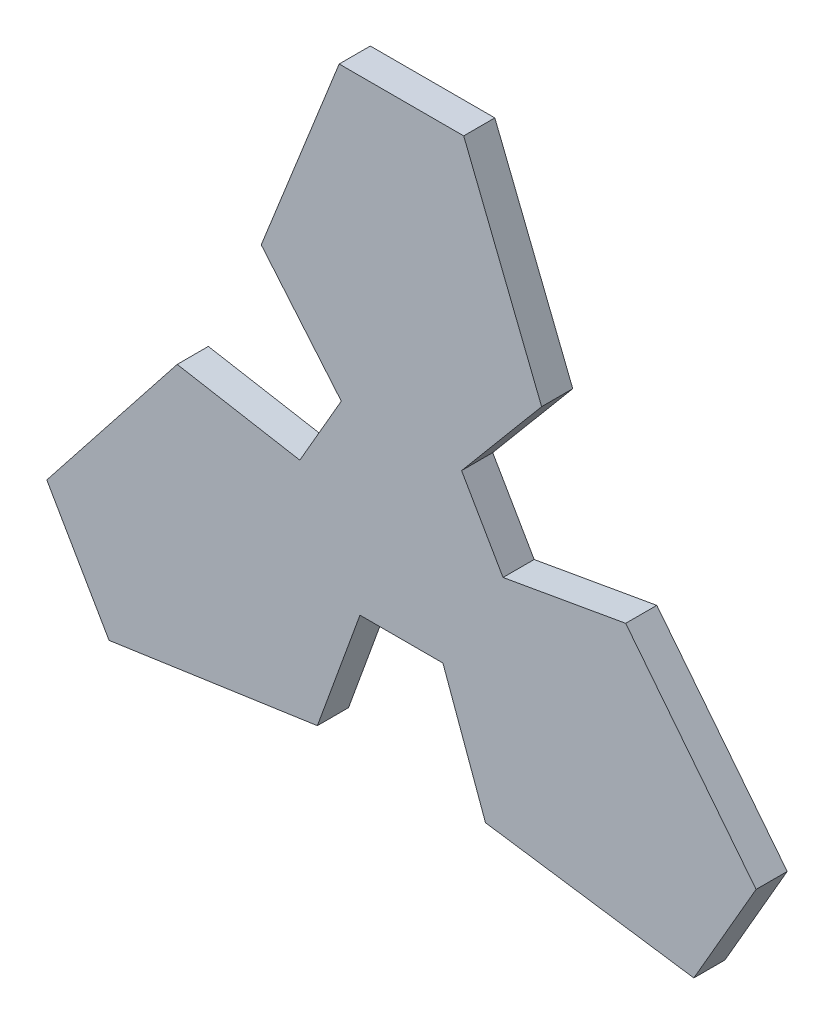
ISO-10303-21;
HEADER;
FILE_DESCRIPTION(('STEP AP214'),'2;1');
FILE_NAME('part.step','',(''),(''),'','','');
FILE_SCHEMA(('AUTOMOTIVE_DESIGN { 1 0 10303 214 1 1 1 1 }'));
ENDSEC;
DATA;
#1=APPLICATION_CONTEXT('core data for automotive mechanical design processes');
#2=APPLICATION_PROTOCOL_DEFINITION('international standard','automotive_design',2000,#1);
#3=PRODUCT_CONTEXT('',#1,'mechanical');
#4=PRODUCT('Part','Part','',(#3));
#5=PRODUCT_RELATED_PRODUCT_CATEGORY('part','',(#4));
#6=PRODUCT_DEFINITION_FORMATION('','',#4);
#7=PRODUCT_DEFINITION_CONTEXT('part definition',#1,'design');
#8=PRODUCT_DEFINITION('design','',#6,#7);
#9=PRODUCT_DEFINITION_SHAPE('','',#8);
#10=(LENGTH_UNIT() NAMED_UNIT(*) SI_UNIT(.MILLI.,.METRE.));
#11=(NAMED_UNIT(*) PLANE_ANGLE_UNIT() SI_UNIT($,.RADIAN.));
#12=(NAMED_UNIT(*) SI_UNIT($,.STERADIAN.) SOLID_ANGLE_UNIT());
#13=UNCERTAINTY_MEASURE_WITH_UNIT(LENGTH_MEASURE(1.E-05),#10,'distance_accuracy_value','');
#14=(GEOMETRIC_REPRESENTATION_CONTEXT(3) GLOBAL_UNCERTAINTY_ASSIGNED_CONTEXT((#13)) GLOBAL_UNIT_ASSIGNED_CONTEXT((#10,
#11,#12)) REPRESENTATION_CONTEXT('',''));
#15=CARTESIAN_POINT('',(0.,0.,0.));
#16=DIRECTION('',(0.,0.,1.));
#17=DIRECTION('',(1.,0.,0.));
#18=AXIS2_PLACEMENT_3D('',#15,#16,#17);
#19=CARTESIAN_POINT('',(-16.3205080756888,1.73205080756886,5.));
#20=DIRECTION('',(-0.173648177666928,-0.984807753012209,0.));
#21=DIRECTION('',(0.984807753012209,-0.173648177666928,0.));
#22=AXIS2_PLACEMENT_3D('',#19,#20,#21);
#23=PLANE('',#22);
#24=DIRECTION('',(-0.984807753012209,0.173648177666928,0.));
#25=VECTOR('',#24,1.);
#26=CARTESIAN_POINT('',(-16.3205080756888,1.73205080756886,0.));
#27=LINE('',#26,#25);
#28=CARTESIAN_POINT('',(-16.3205080756888,1.73205080756886,0.));
#29=VERTEX_POINT('',#28);
#30=CARTESIAN_POINT('',(-36.016663135933,5.20501436090742,0.));
#31=VERTEX_POINT('',#30);
#32=EDGE_CURVE('E208',#29,#31,#27,.T.);
#33=ORIENTED_EDGE('',*,*,#32,.T.);
#34=DIRECTION('',(0.,0.,-1.));
#35=VECTOR('',#34,1.);
#36=CARTESIAN_POINT('',(-36.016663135933,5.20501436090742,5.));
#37=LINE('',#36,#35);
#38=CARTESIAN_POINT('',(-36.016663135933,5.20501436090742,5.));
#39=VERTEX_POINT('',#38);
#40=EDGE_CURVE('E52',#39,#31,#37,.T.);
#41=ORIENTED_EDGE('',*,*,#40,.F.);
#42=DIRECTION('',(-0.984807753012209,0.173648177666928,0.));
#43=VECTOR('',#42,1.);
#44=CARTESIAN_POINT('',(-16.3205080756888,1.73205080756886,5.));
#45=LINE('',#44,#43);
#46=CARTESIAN_POINT('',(-16.3205080756888,1.73205080756886,5.));
#47=VERTEX_POINT('',#46);
#48=EDGE_CURVE('E134',#47,#39,#45,.T.);
#49=ORIENTED_EDGE('',*,*,#48,.F.);
#50=DIRECTION('',(0.,0.,-1.));
#51=VECTOR('',#50,1.);
#52=CARTESIAN_POINT('',(-16.3205080756888,1.73205080756886,5.));
#53=LINE('',#52,#51);
#54=EDGE_CURVE('E11',#47,#29,#53,.T.);
#55=ORIENTED_EDGE('',*,*,#54,.T.);
#56=EDGE_LOOP('',(#33,#41,#49,#55));
#57=FACE_BOUND('',#56,.T.);
#58=ADVANCED_FACE('F43',(#57),#23,.F.);
#59=CARTESIAN_POINT('',(-36.016663135933,5.20501436090742,5.));
#60=DIRECTION('',(0.7850485597326,-0.619434224806614,0.));
#61=DIRECTION('',(0.619434224806614,0.7850485597326,0.));
#62=AXIS2_PLACEMENT_3D('',#59,#60,#61);
#63=PLANE('',#62);
#64=DIRECTION('',(-0.619434224806614,-0.7850485597326,0.));
#65=VECTOR('',#64,1.);
#66=CARTESIAN_POINT('',(-36.016663135933,5.20501436090742,0.));
#67=LINE('',#66,#65);
#68=CARTESIAN_POINT('',(-56.9615242270665,-21.3397459621553,0.));
#69=VERTEX_POINT('',#68);
#70=EDGE_CURVE('E211',#31,#69,#67,.T.);
#71=ORIENTED_EDGE('',*,*,#70,.T.);
#72=DIRECTION('',(0.,0.,-1.));
#73=VECTOR('',#72,1.);
#74=CARTESIAN_POINT('',(-56.9615242270665,-21.3397459621553,5.));
#75=LINE('',#74,#73);
#76=CARTESIAN_POINT('',(-56.9615242270665,-21.3397459621553,5.));
#77=VERTEX_POINT('',#76);
#78=EDGE_CURVE('E311',#77,#69,#75,.T.);
#79=ORIENTED_EDGE('',*,*,#78,.F.);
#80=DIRECTION('',(-0.619434224806614,-0.7850485597326,0.));
#81=VECTOR('',#80,1.);
#82=CARTESIAN_POINT('',(-36.016663135933,5.20501436090742,5.));
#83=LINE('',#82,#81);
#84=EDGE_CURVE('E321',#39,#77,#83,.T.);
#85=ORIENTED_EDGE('',*,*,#84,.F.);
#86=ORIENTED_EDGE('',*,*,#40,.T.);
#87=EDGE_LOOP('',(#71,#79,#85,#86));
#88=FACE_BOUND('',#87,.T.);
#89=ADVANCED_FACE('F319',(#88),#63,.F.);
#90=CARTESIAN_POINT('',(-56.9615242270665,-21.3397459621553,5.));
#91=DIRECTION('',(0.866025403784442,0.499999999999994,0.));
#92=DIRECTION('',(-0.499999999999994,0.866025403784442,0.));
#93=AXIS2_PLACEMENT_3D('',#90,#91,#92);
#94=PLANE('',#93);
#95=DIRECTION('',(0.499999999999994,-0.866025403784442,0.));
#96=VECTOR('',#95,1.);
#97=CARTESIAN_POINT('',(-56.9615242270665,-21.3397459621553,0.));
#98=LINE('',#97,#96);
#99=CARTESIAN_POINT('',(-46.9615242270667,-38.660254037844,0.));
#100=VERTEX_POINT('',#99);
#101=EDGE_CURVE('E214',#69,#100,#98,.T.);
#102=ORIENTED_EDGE('',*,*,#101,.T.);
#103=DIRECTION('',(0.,0.,-1.));
#104=VECTOR('',#103,1.);
#105=CARTESIAN_POINT('',(-46.9615242270667,-38.660254037844,5.));
#106=LINE('',#105,#104);
#107=CARTESIAN_POINT('',(-46.9615242270667,-38.660254037844,5.));
#108=VERTEX_POINT('',#107);
#109=EDGE_CURVE('E307',#108,#100,#106,.T.);
#110=ORIENTED_EDGE('',*,*,#109,.F.);
#111=DIRECTION('',(0.499999999999994,-0.866025403784442,0.));
#112=VECTOR('',#111,1.);
#113=CARTESIAN_POINT('',(-56.9615242270665,-21.3397459621553,5.));
#114=LINE('',#113,#112);
#115=EDGE_CURVE('E341',#77,#108,#114,.T.);
#116=ORIENTED_EDGE('',*,*,#115,.F.);
#117=ORIENTED_EDGE('',*,*,#78,.T.);
#118=EDGE_LOOP('',(#102,#110,#116,#117));
#119=FACE_BOUND('',#118,.T.);
#120=ADVANCED_FACE('F331',(#119),#94,.F.);
#121=CARTESIAN_POINT('',(-13.5006569043578,-33.7938524157182,5.));
#122=DIRECTION('',(-0.143921494789726,0.989589108336127,0.));
#123=DIRECTION('',(-0.989589108336127,-0.143921494789726,0.));
#124=AXIS2_PLACEMENT_3D('',#121,#122,#123);
#125=PLANE('',#124);
#126=DIRECTION('',(0.989589108336127,0.143921494789726,0.));
#127=VECTOR('',#126,1.);
#128=CARTESIAN_POINT('',(-13.5006569043578,-33.7938524157182,0.));
#129=LINE('',#128,#127);
#130=CARTESIAN_POINT('',(-13.5006569043578,-33.7938524157182,0.));
#131=VERTEX_POINT('',#130);
#132=EDGE_CURVE('E217',#100,#131,#129,.T.);
#133=ORIENTED_EDGE('',*,*,#132,.T.);
#134=DIRECTION('',(0.,0.,-1.));
#135=VECTOR('',#134,1.);
#136=CARTESIAN_POINT('',(-13.5006569043578,-33.7938524157182,5.));
#137=LINE('',#136,#135);
#138=CARTESIAN_POINT('',(-13.5006569043578,-33.7938524157182,5.));
#139=VERTEX_POINT('',#138);
#140=EDGE_CURVE('E303',#139,#131,#137,.T.);
#141=ORIENTED_EDGE('',*,*,#140,.F.);
#142=DIRECTION('',(0.989589108336127,0.143921494789726,0.));
#143=VECTOR('',#142,1.);
#144=CARTESIAN_POINT('',(-13.5006569043578,-33.7938524157182,5.));
#145=LINE('',#144,#143);
#146=EDGE_CURVE('E337',#108,#139,#145,.T.);
#147=ORIENTED_EDGE('',*,*,#146,.F.);
#148=ORIENTED_EDGE('',*,*,#109,.T.);
#149=EDGE_LOOP('',(#133,#141,#147,#148));
#150=FACE_BOUND('',#149,.T.);
#151=ADVANCED_FACE('F335',(#150),#125,.F.);
#152=CARTESIAN_POINT('',(-6.66025403784439,-15.,5.));
#153=DIRECTION('',(-0.939692620785908,0.34202014332567,0.));
#154=DIRECTION('',(-0.34202014332567,-0.939692620785908,0.));
#155=AXIS2_PLACEMENT_3D('',#152,#153,#154);
#156=PLANE('',#155);
#157=DIRECTION('',(0.34202014332567,0.939692620785908,0.));
#158=VECTOR('',#157,1.);
#159=CARTESIAN_POINT('',(-6.66025403784439,-15.,0.));
#160=LINE('',#159,#158);
#161=CARTESIAN_POINT('',(-6.66025403784439,-15.,0.));
#162=VERTEX_POINT('',#161);
#163=EDGE_CURVE('E220',#131,#162,#160,.T.);
#164=ORIENTED_EDGE('',*,*,#163,.T.);
#165=DIRECTION('',(0.,0.,-1.));
#166=VECTOR('',#165,1.);
#167=CARTESIAN_POINT('',(-6.66025403784439,-15.,5.));
#168=LINE('',#167,#166);
#169=CARTESIAN_POINT('',(-6.66025403784439,-15.,5.));
#170=VERTEX_POINT('',#169);
#171=EDGE_CURVE('E299',#170,#162,#168,.T.);
#172=ORIENTED_EDGE('',*,*,#171,.F.);
#173=DIRECTION('',(0.34202014332567,0.939692620785908,0.));
#174=VECTOR('',#173,1.);
#175=CARTESIAN_POINT('',(-6.66025403784439,-15.,5.));
#176=LINE('',#175,#174);
#177=EDGE_CURVE('E340',#139,#170,#176,.T.);
#178=ORIENTED_EDGE('',*,*,#177,.F.);
#179=ORIENTED_EDGE('',*,*,#140,.T.);
#180=EDGE_LOOP('',(#164,#172,#178,#179));
#181=FACE_BOUND('',#180,.T.);
#182=ADVANCED_FACE('F409',(#181),#156,.F.);
#183=CARTESIAN_POINT('',(0.,-15.,5.));
#184=DIRECTION('',(0.,1.,0.));
#185=DIRECTION('',(-1.,0.,0.));
#186=AXIS2_PLACEMENT_3D('',#183,#184,#185);
#187=PLANE('',#186);
#188=DIRECTION('',(1.,0.,0.));
#189=VECTOR('',#188,1.);
#190=CARTESIAN_POINT('',(0.,-15.,0.));
#191=LINE('',#190,#189);
#192=CARTESIAN_POINT('',(6.6602540378444,-15.,0.));
#193=VERTEX_POINT('',#192);
#194=EDGE_CURVE('E224',#162,#193,#191,.T.);
#195=ORIENTED_EDGE('',*,*,#194,.T.);
#196=DIRECTION('',(0.,0.,-1.));
#197=VECTOR('',#196,1.);
#198=CARTESIAN_POINT('',(6.6602540378444,-15.,5.));
#199=LINE('',#198,#197);
#200=CARTESIAN_POINT('',(6.6602540378444,-15.,5.));
#201=VERTEX_POINT('',#200);
#202=EDGE_CURVE('E295',#201,#193,#199,.T.);
#203=ORIENTED_EDGE('',*,*,#202,.F.);
#204=DIRECTION('',(1.,0.,0.));
#205=VECTOR('',#204,1.);
#206=CARTESIAN_POINT('',(0.,-15.,5.));
#207=LINE('',#206,#205);
#208=EDGE_CURVE('E345',#170,#201,#207,.T.);
#209=ORIENTED_EDGE('',*,*,#208,.F.);
#210=ORIENTED_EDGE('',*,*,#171,.T.);
#211=EDGE_LOOP('',(#195,#203,#209,#210));
#212=FACE_BOUND('',#211,.T.);
#213=ADVANCED_FACE('F412',(#212),#187,.F.);
#214=CARTESIAN_POINT('',(6.6602540378444,-15.,5.));
#215=DIRECTION('',(0.939692620785908,0.342020143325671,0.));
#216=DIRECTION('',(-0.342020143325671,0.939692620785908,0.));
#217=AXIS2_PLACEMENT_3D('',#214,#215,#216);
#218=PLANE('',#217);
#219=DIRECTION('',(0.342020143325671,-0.939692620785908,0.));
#220=VECTOR('',#219,1.);
#221=CARTESIAN_POINT('',(6.6602540378444,-15.,0.));
#222=LINE('',#221,#220);
#223=CARTESIAN_POINT('',(13.5006569043578,-33.7938524157182,0.));
#224=VERTEX_POINT('',#223);
#225=EDGE_CURVE('E227',#193,#224,#222,.T.);
#226=ORIENTED_EDGE('',*,*,#225,.T.);
#227=DIRECTION('',(0.,0.,-1.));
#228=VECTOR('',#227,1.);
#229=CARTESIAN_POINT('',(13.5006569043578,-33.7938524157182,5.));
#230=LINE('',#229,#228);
#231=CARTESIAN_POINT('',(13.5006569043578,-33.7938524157182,5.));
#232=VERTEX_POINT('',#231);
#233=EDGE_CURVE('E291',#232,#224,#230,.T.);
#234=ORIENTED_EDGE('',*,*,#233,.F.);
#235=DIRECTION('',(0.342020143325671,-0.939692620785908,0.));
#236=VECTOR('',#235,1.);
#237=CARTESIAN_POINT('',(6.6602540378444,-15.,5.));
#238=LINE('',#237,#236);
#239=EDGE_CURVE('E352',#201,#232,#238,.T.);
#240=ORIENTED_EDGE('',*,*,#239,.F.);
#241=ORIENTED_EDGE('',*,*,#202,.T.);
#242=EDGE_LOOP('',(#226,#234,#240,#241));
#243=FACE_BOUND('',#242,.T.);
#244=ADVANCED_FACE('F416',(#243),#218,.F.);
#245=CARTESIAN_POINT('',(13.5006569043578,-33.7938524157182,5.));
#246=DIRECTION('',(0.143921494789742,0.989589108336125,0.));
#247=DIRECTION('',(-0.989589108336125,0.143921494789742,0.));
#248=AXIS2_PLACEMENT_3D('',#245,#246,#247);
#249=PLANE('',#248);
#250=DIRECTION('',(0.989589108336125,-0.143921494789742,0.));
#251=VECTOR('',#250,1.);
#252=CARTESIAN_POINT('',(13.5006569043578,-33.7938524157182,0.));
#253=LINE('',#252,#251);
#254=CARTESIAN_POINT('',(46.9615242270663,-38.6602540378445,0.));
#255=VERTEX_POINT('',#254);
#256=EDGE_CURVE('E230',#224,#255,#253,.T.);
#257=ORIENTED_EDGE('',*,*,#256,.T.);
#258=DIRECTION('',(0.,0.,-1.));
#259=VECTOR('',#258,1.);
#260=CARTESIAN_POINT('',(46.9615242270663,-38.6602540378445,5.));
#261=LINE('',#260,#259);
#262=CARTESIAN_POINT('',(46.9615242270663,-38.6602540378445,5.));
#263=VERTEX_POINT('',#262);
#264=EDGE_CURVE('E287',#263,#255,#261,.T.);
#265=ORIENTED_EDGE('',*,*,#264,.F.);
#266=DIRECTION('',(0.989589108336125,-0.143921494789742,0.));
#267=VECTOR('',#266,1.);
#268=CARTESIAN_POINT('',(13.5006569043578,-33.7938524157182,5.));
#269=LINE('',#268,#267);
#270=EDGE_CURVE('E355',#232,#263,#269,.T.);
#271=ORIENTED_EDGE('',*,*,#270,.F.);
#272=ORIENTED_EDGE('',*,*,#233,.T.);
#273=EDGE_LOOP('',(#257,#265,#271,#272));
#274=FACE_BOUND('',#273,.T.);
#275=ADVANCED_FACE('F420',(#274),#249,.F.);
#276=CARTESIAN_POINT('',(46.9615242270663,-38.6602540378445,5.));
#277=DIRECTION('',(-0.866025403784438,0.500000000000002,0.));
#278=DIRECTION('',(-0.500000000000002,-0.866025403784438,0.));
#279=AXIS2_PLACEMENT_3D('',#276,#277,#278);
#280=PLANE('',#279);
#281=DIRECTION('',(0.500000000000002,0.866025403784438,0.));
#282=VECTOR('',#281,1.);
#283=CARTESIAN_POINT('',(46.9615242270663,-38.6602540378445,0.));
#284=LINE('',#283,#282);
#285=CARTESIAN_POINT('',(56.9615242270662,-21.3397459621559,0.));
#286=VERTEX_POINT('',#285);
#287=EDGE_CURVE('E233',#255,#286,#284,.T.);
#288=ORIENTED_EDGE('',*,*,#287,.T.);
#289=DIRECTION('',(0.,0.,-1.));
#290=VECTOR('',#289,1.);
#291=CARTESIAN_POINT('',(56.9615242270662,-21.3397459621559,5.));
#292=LINE('',#291,#290);
#293=CARTESIAN_POINT('',(56.9615242270662,-21.3397459621559,5.));
#294=VERTEX_POINT('',#293);
#295=EDGE_CURVE('E283',#294,#286,#292,.T.);
#296=ORIENTED_EDGE('',*,*,#295,.F.);
#297=DIRECTION('',(0.500000000000002,0.866025403784438,0.));
#298=VECTOR('',#297,1.);
#299=CARTESIAN_POINT('',(46.9615242270663,-38.6602540378445,5.));
#300=LINE('',#299,#298);
#301=EDGE_CURVE('E358',#263,#294,#300,.T.);
#302=ORIENTED_EDGE('',*,*,#301,.F.);
#303=ORIENTED_EDGE('',*,*,#264,.T.);
#304=EDGE_LOOP('',(#288,#296,#302,#303));
#305=FACE_BOUND('',#304,.T.);
#306=ADVANCED_FACE('F424',(#305),#280,.F.);
#307=CARTESIAN_POINT('',(36.016663135933,5.20501436090745,5.));
#308=DIRECTION('',(-0.78504855973261,-0.619434224806601,0.));
#309=DIRECTION('',(0.619434224806601,-0.78504855973261,0.));
#310=AXIS2_PLACEMENT_3D('',#307,#308,#309);
#311=PLANE('',#310);
#312=DIRECTION('',(-0.619434224806601,0.78504855973261,0.));
#313=VECTOR('',#312,1.);
#314=CARTESIAN_POINT('',(36.016663135933,5.20501436090745,0.));
#315=LINE('',#314,#313);
#316=CARTESIAN_POINT('',(36.016663135933,5.20501436090745,0.));
#317=VERTEX_POINT('',#316);
#318=EDGE_CURVE('E236',#286,#317,#315,.T.);
#319=ORIENTED_EDGE('',*,*,#318,.T.);
#320=DIRECTION('',(0.,0.,-1.));
#321=VECTOR('',#320,1.);
#322=CARTESIAN_POINT('',(36.016663135933,5.20501436090745,5.));
#323=LINE('',#322,#321);
#324=CARTESIAN_POINT('',(36.016663135933,5.20501436090745,5.));
#325=VERTEX_POINT('',#324);
#326=EDGE_CURVE('E279',#325,#317,#323,.T.);
#327=ORIENTED_EDGE('',*,*,#326,.F.);
#328=DIRECTION('',(-0.619434224806601,0.78504855973261,0.));
#329=VECTOR('',#328,1.);
#330=CARTESIAN_POINT('',(36.016663135933,5.20501436090745,5.));
#331=LINE('',#330,#329);
#332=EDGE_CURVE('E361',#294,#325,#331,.T.);
#333=ORIENTED_EDGE('',*,*,#332,.F.);
#334=ORIENTED_EDGE('',*,*,#295,.T.);
#335=EDGE_LOOP('',(#319,#327,#333,#334));
#336=FACE_BOUND('',#335,.T.);
#337=ADVANCED_FACE('F428',(#336),#311,.F.);
#338=CARTESIAN_POINT('',(16.3205080756888,1.73205080756887,5.));
#339=DIRECTION('',(0.173648177666929,-0.984807753012208,0.));
#340=DIRECTION('',(0.984807753012208,0.173648177666929,0.));
#341=AXIS2_PLACEMENT_3D('',#338,#339,#340);
#342=PLANE('',#341);
#343=DIRECTION('',(-0.984807753012208,-0.173648177666929,0.));
#344=VECTOR('',#343,1.);
#345=CARTESIAN_POINT('',(16.3205080756888,1.73205080756887,0.));
#346=LINE('',#345,#344);
#347=CARTESIAN_POINT('',(16.3205080756888,1.73205080756887,0.));
#348=VERTEX_POINT('',#347);
#349=EDGE_CURVE('E239',#317,#348,#346,.T.);
#350=ORIENTED_EDGE('',*,*,#349,.T.);
#351=DIRECTION('',(0.,0.,-1.));
#352=VECTOR('',#351,1.);
#353=CARTESIAN_POINT('',(16.3205080756888,1.73205080756887,5.));
#354=LINE('',#353,#352);
#355=CARTESIAN_POINT('',(16.3205080756888,1.73205080756887,5.));
#356=VERTEX_POINT('',#355);
#357=EDGE_CURVE('E275',#356,#348,#354,.T.);
#358=ORIENTED_EDGE('',*,*,#357,.F.);
#359=DIRECTION('',(-0.984807753012208,-0.173648177666929,0.));
#360=VECTOR('',#359,1.);
#361=CARTESIAN_POINT('',(16.3205080756888,1.73205080756887,5.));
#362=LINE('',#361,#360);
#363=EDGE_CURVE('E364',#325,#356,#362,.T.);
#364=ORIENTED_EDGE('',*,*,#363,.F.);
#365=ORIENTED_EDGE('',*,*,#326,.T.);
#366=EDGE_LOOP('',(#350,#358,#364,#365));
#367=FACE_BOUND('',#366,.T.);
#368=ADVANCED_FACE('F432',(#367),#342,.F.);
#369=CARTESIAN_POINT('',(12.9903810567666,7.5,5.));
#370=DIRECTION('',(-0.866025403784438,-0.5,0.));
#371=DIRECTION('',(0.5,-0.866025403784438,0.));
#372=AXIS2_PLACEMENT_3D('',#369,#370,#371);
#373=PLANE('',#372);
#374=DIRECTION('',(-0.5,0.866025403784439,0.));
#375=VECTOR('',#374,1.);
#376=CARTESIAN_POINT('',(12.9903810567666,7.5,0.));
#377=LINE('',#376,#375);
#378=CARTESIAN_POINT('',(9.66025403784438,13.2679491924311,0.));
#379=VERTEX_POINT('',#378);
#380=EDGE_CURVE('E243',#348,#379,#377,.T.);
#381=ORIENTED_EDGE('',*,*,#380,.T.);
#382=DIRECTION('',(0.,0.,-1.));
#383=VECTOR('',#382,1.);
#384=CARTESIAN_POINT('',(9.66025403784438,13.2679491924311,5.));
#385=LINE('',#384,#383);
#386=CARTESIAN_POINT('',(9.66025403784438,13.2679491924311,5.));
#387=VERTEX_POINT('',#386);
#388=EDGE_CURVE('E271',#387,#379,#385,.T.);
#389=ORIENTED_EDGE('',*,*,#388,.F.);
#390=DIRECTION('',(-0.5,0.866025403784438,0.));
#391=VECTOR('',#390,1.);
#392=CARTESIAN_POINT('',(12.9903810567666,7.5,5.));
#393=LINE('',#392,#391);
#394=EDGE_CURVE('E367',#356,#387,#393,.T.);
#395=ORIENTED_EDGE('',*,*,#394,.F.);
#396=ORIENTED_EDGE('',*,*,#357,.T.);
#397=EDGE_LOOP('',(#381,#389,#395,#396));
#398=FACE_BOUND('',#397,.T.);
#399=ADVANCED_FACE('F436',(#398),#373,.F.);
#400=CARTESIAN_POINT('',(9.66025403784438,13.2679491924311,5.));
#401=DIRECTION('',(-0.766044443118979,0.642787609686538,0.));
#402=DIRECTION('',(-0.642787609686538,-0.766044443118979,0.));
#403=AXIS2_PLACEMENT_3D('',#400,#401,#402);
#404=PLANE('',#403);
#405=DIRECTION('',(0.642787609686538,0.766044443118979,0.));
#406=VECTOR('',#405,1.);
#407=CARTESIAN_POINT('',(9.66025403784438,13.2679491924311,0.));
#408=LINE('',#407,#406);
#409=CARTESIAN_POINT('',(22.5160062315751,28.5888380548107,0.));
#410=VERTEX_POINT('',#409);
#411=EDGE_CURVE('E246',#379,#410,#408,.T.);
#412=ORIENTED_EDGE('',*,*,#411,.T.);
#413=DIRECTION('',(0.,0.,-1.));
#414=VECTOR('',#413,1.);
#415=CARTESIAN_POINT('',(22.5160062315751,28.5888380548107,5.));
#416=LINE('',#415,#414);
#417=CARTESIAN_POINT('',(22.5160062315751,28.5888380548107,5.));
#418=VERTEX_POINT('',#417);
#419=EDGE_CURVE('E267',#418,#410,#416,.T.);
#420=ORIENTED_EDGE('',*,*,#419,.F.);
#421=DIRECTION('',(0.642787609686538,0.766044443118979,0.));
#422=VECTOR('',#421,1.);
#423=CARTESIAN_POINT('',(9.66025403784438,13.2679491924311,5.));
#424=LINE('',#423,#422);
#425=EDGE_CURVE('E370',#387,#418,#424,.T.);
#426=ORIENTED_EDGE('',*,*,#425,.F.);
#427=ORIENTED_EDGE('',*,*,#388,.T.);
#428=EDGE_LOOP('',(#412,#420,#426,#427));
#429=FACE_BOUND('',#428,.T.);
#430=ADVANCED_FACE('F378',(#429),#404,.F.);
#431=CARTESIAN_POINT('',(22.5160062315751,28.5888380548107,5.));
#432=DIRECTION('',(-0.928970054522343,-0.370154883529523,0.));
#433=DIRECTION('',(0.370154883529523,-0.928970054522343,0.));
#434=AXIS2_PLACEMENT_3D('',#431,#432,#433);
#435=PLANE('',#434);
#436=DIRECTION('',(-0.370154883529523,0.928970054522343,0.));
#437=VECTOR('',#436,1.);
#438=CARTESIAN_POINT('',(22.5160062315751,28.5888380548107,0.));
#439=LINE('',#438,#437);
#440=CARTESIAN_POINT('',(9.99999999999978,60.0000000000001,0.));
#441=VERTEX_POINT('',#440);
#442=EDGE_CURVE('E249',#410,#441,#439,.T.);
#443=ORIENTED_EDGE('',*,*,#442,.T.);
#444=DIRECTION('',(0.,0.,-1.));
#445=VECTOR('',#444,1.);
#446=CARTESIAN_POINT('',(9.99999999999978,60.0000000000001,5.));
#447=LINE('',#446,#445);
#448=CARTESIAN_POINT('',(9.99999999999978,60.0000000000001,5.));
#449=VERTEX_POINT('',#448);
#450=EDGE_CURVE('E195',#449,#441,#447,.T.);
#451=ORIENTED_EDGE('',*,*,#450,.F.);
#452=DIRECTION('',(-0.370154883529523,0.928970054522343,0.));
#453=VECTOR('',#452,1.);
#454=CARTESIAN_POINT('',(22.5160062315751,28.5888380548107,5.));
#455=LINE('',#454,#453);
#456=EDGE_CURVE('E184',#418,#449,#455,.T.);
#457=ORIENTED_EDGE('',*,*,#456,.F.);
#458=ORIENTED_EDGE('',*,*,#419,.T.);
#459=EDGE_LOOP('',(#443,#451,#457,#458));
#460=FACE_BOUND('',#459,.T.);
#461=ADVANCED_FACE('F382',(#460),#435,.F.);
#462=CARTESIAN_POINT('',(9.99999999999978,60.0000000000001,5.));
#463=DIRECTION('',(0.,-1.,0.));
#464=DIRECTION('',(1.,0.,0.));
#465=AXIS2_PLACEMENT_3D('',#462,#463,#464);
#466=PLANE('',#465);
#467=DIRECTION('',(-1.,0.,0.));
#468=VECTOR('',#467,1.);
#469=CARTESIAN_POINT('',(9.99999999999978,60.0000000000001,0.));
#470=LINE('',#469,#468);
#471=CARTESIAN_POINT('',(-10.,60.,0.));
#472=VERTEX_POINT('',#471);
#473=EDGE_CURVE('E193',#441,#472,#470,.T.);
#474=ORIENTED_EDGE('',*,*,#473,.T.);
#475=DIRECTION('',(0.,0.,-1.));
#476=VECTOR('',#475,1.);
#477=CARTESIAN_POINT('',(-10.,60.,5.));
#478=LINE('',#477,#476);
#479=CARTESIAN_POINT('',(-10.,60.,5.));
#480=VERTEX_POINT('',#479);
#481=EDGE_CURVE('E190',#480,#472,#478,.T.);
#482=ORIENTED_EDGE('',*,*,#481,.F.);
#483=DIRECTION('',(-1.,0.,0.));
#484=VECTOR('',#483,1.);
#485=CARTESIAN_POINT('',(9.99999999999978,60.0000000000001,5.));
#486=LINE('',#485,#484);
#487=EDGE_CURVE('E178',#449,#480,#486,.T.);
#488=ORIENTED_EDGE('',*,*,#487,.F.);
#489=ORIENTED_EDGE('',*,*,#450,.T.);
#490=EDGE_LOOP('',(#474,#482,#488,#489));
#491=FACE_BOUND('',#490,.T.);
#492=ADVANCED_FACE('F191',(#491),#466,.F.);
#493=CARTESIAN_POINT('',(-22.5160062315751,28.5888380548107,5.));
#494=DIRECTION('',(0.928970054522345,-0.370154883529518,0.));
#495=DIRECTION('',(0.370154883529518,0.928970054522345,0.));
#496=AXIS2_PLACEMENT_3D('',#493,#494,#495);
#497=PLANE('',#496);
#498=DIRECTION('',(-0.370154883529518,-0.928970054522345,0.));
#499=VECTOR('',#498,1.);
#500=CARTESIAN_POINT('',(-22.5160062315751,28.5888380548107,0.));
#501=LINE('',#500,#499);
#502=CARTESIAN_POINT('',(-22.5160062315751,28.5888380548107,0.));
#503=VERTEX_POINT('',#502);
#504=EDGE_CURVE('E120',#472,#503,#501,.T.);
#505=ORIENTED_EDGE('',*,*,#504,.T.);
#506=DIRECTION('',(0.,0.,-1.));
#507=VECTOR('',#506,1.);
#508=CARTESIAN_POINT('',(-22.5160062315751,28.5888380548107,5.));
#509=LINE('',#508,#507);
#510=CARTESIAN_POINT('',(-22.5160062315751,28.5888380548107,5.));
#511=VERTEX_POINT('',#510);
#512=EDGE_CURVE('E196',#511,#503,#509,.T.);
#513=ORIENTED_EDGE('',*,*,#512,.F.);
#514=DIRECTION('',(-0.370154883529518,-0.928970054522345,0.));
#515=VECTOR('',#514,1.);
#516=CARTESIAN_POINT('',(-22.5160062315751,28.5888380548107,5.));
#517=LINE('',#516,#515);
#518=EDGE_CURVE('E182',#480,#511,#517,.T.);
#519=ORIENTED_EDGE('',*,*,#518,.F.);
#520=ORIENTED_EDGE('',*,*,#481,.T.);
#521=EDGE_LOOP('',(#505,#513,#519,#520));
#522=FACE_BOUND('',#521,.T.);
#523=ADVANCED_FACE('F198',(#522),#497,.F.);
#524=CARTESIAN_POINT('',(-9.66025403784438,13.2679491924311,5.));
#525=DIRECTION('',(0.766044443118979,0.642787609686538,0.));
#526=DIRECTION('',(-0.642787609686538,0.766044443118979,0.));
#527=AXIS2_PLACEMENT_3D('',#524,#525,#526);
#528=PLANE('',#527);
#529=DIRECTION('',(0.642787609686538,-0.766044443118979,0.));
#530=VECTOR('',#529,1.);
#531=CARTESIAN_POINT('',(-9.66025403784438,13.2679491924311,0.));
#532=LINE('',#531,#530);
#533=CARTESIAN_POINT('',(-9.66025403784438,13.2679491924311,0.));
#534=VERTEX_POINT('',#533);
#535=EDGE_CURVE('E127',#503,#534,#532,.T.);
#536=ORIENTED_EDGE('',*,*,#535,.T.);
#537=DIRECTION('',(0.,0.,-1.));
#538=VECTOR('',#537,1.);
#539=CARTESIAN_POINT('',(-9.66025403784438,13.2679491924311,5.));
#540=LINE('',#539,#538);
#541=CARTESIAN_POINT('',(-9.66025403784438,13.2679491924311,5.));
#542=VERTEX_POINT('',#541);
#543=EDGE_CURVE('E204',#542,#534,#540,.T.);
#544=ORIENTED_EDGE('',*,*,#543,.F.);
#545=DIRECTION('',(0.642787609686538,-0.766044443118979,0.));
#546=VECTOR('',#545,1.);
#547=CARTESIAN_POINT('',(-9.66025403784438,13.2679491924311,5.));
#548=LINE('',#547,#546);
#549=EDGE_CURVE('E201',#511,#542,#548,.T.);
#550=ORIENTED_EDGE('',*,*,#549,.F.);
#551=ORIENTED_EDGE('',*,*,#512,.T.);
#552=EDGE_LOOP('',(#536,#544,#550,#551));
#553=FACE_BOUND('',#552,.T.);
#554=ADVANCED_FACE('F384',(#553),#528,.F.);
#555=CARTESIAN_POINT('',(-12.9903810567666,7.5,5.));
#556=DIRECTION('',(0.866025403784438,-0.5,0.));
#557=DIRECTION('',(0.5,0.866025403784438,0.));
#558=AXIS2_PLACEMENT_3D('',#555,#556,#557);
#559=PLANE('',#558);
#560=DIRECTION('',(-0.5,-0.866025403784439,0.));
#561=VECTOR('',#560,1.);
#562=CARTESIAN_POINT('',(-12.9903810567666,7.5,0.));
#563=LINE('',#562,#561);
#564=EDGE_CURVE('E258',#534,#29,#563,.T.);
#565=ORIENTED_EDGE('',*,*,#564,.T.);
#566=ORIENTED_EDGE('',*,*,#54,.F.);
#567=DIRECTION('',(-0.5,-0.866025403784439,0.));
#568=VECTOR('',#567,1.);
#569=CARTESIAN_POINT('',(-12.9903810567666,7.5,5.));
#570=LINE('',#569,#568);
#571=EDGE_CURVE('E60',#542,#47,#570,.T.);
#572=ORIENTED_EDGE('',*,*,#571,.F.);
#573=ORIENTED_EDGE('',*,*,#543,.T.);
#574=EDGE_LOOP('',(#565,#566,#572,#573));
#575=FACE_BOUND('',#574,.T.);
#576=ADVANCED_FACE('F383',(#575),#559,.F.);
#577=CARTESIAN_POINT('',(0.,0.,5.));
#578=DIRECTION('',(0.,0.,-1.));
#579=DIRECTION('',(-1.,0.,0.));
#580=AXIS2_PLACEMENT_3D('',#577,#578,#579);
#581=PLANE('',#580);
#582=ORIENTED_EDGE('',*,*,#571,.T.);
#583=ORIENTED_EDGE('',*,*,#48,.T.);
#584=ORIENTED_EDGE('',*,*,#84,.T.);
#585=ORIENTED_EDGE('',*,*,#115,.T.);
#586=ORIENTED_EDGE('',*,*,#146,.T.);
#587=ORIENTED_EDGE('',*,*,#177,.T.);
#588=ORIENTED_EDGE('',*,*,#208,.T.);
#589=ORIENTED_EDGE('',*,*,#239,.T.);
#590=ORIENTED_EDGE('',*,*,#270,.T.);
#591=ORIENTED_EDGE('',*,*,#301,.T.);
#592=ORIENTED_EDGE('',*,*,#332,.T.);
#593=ORIENTED_EDGE('',*,*,#363,.T.);
#594=ORIENTED_EDGE('',*,*,#394,.T.);
#595=ORIENTED_EDGE('',*,*,#425,.T.);
#596=ORIENTED_EDGE('',*,*,#456,.T.);
#597=ORIENTED_EDGE('',*,*,#487,.T.);
#598=ORIENTED_EDGE('',*,*,#518,.T.);
#599=ORIENTED_EDGE('',*,*,#549,.T.);
#600=EDGE_LOOP('',(#582,#583,#584,#585,#586,#587,#588,#589,#590,#591,#592,#593,#594,#595,#596,
#597,#598,#599));
#601=FACE_BOUND('',#600,.T.);
#602=ADVANCED_FACE('F180',(#601),#581,.F.);
#603=CARTESIAN_POINT('',(0.,0.,0.));
#604=DIRECTION('',(0.,0.,-1.));
#605=DIRECTION('',(-1.,0.,0.));
#606=AXIS2_PLACEMENT_3D('',#603,#604,#605);
#607=PLANE('',#606);
#608=ORIENTED_EDGE('',*,*,#32,.F.);
#609=ORIENTED_EDGE('',*,*,#564,.F.);
#610=ORIENTED_EDGE('',*,*,#535,.F.);
#611=ORIENTED_EDGE('',*,*,#504,.F.);
#612=ORIENTED_EDGE('',*,*,#473,.F.);
#613=ORIENTED_EDGE('',*,*,#442,.F.);
#614=ORIENTED_EDGE('',*,*,#411,.F.);
#615=ORIENTED_EDGE('',*,*,#380,.F.);
#616=ORIENTED_EDGE('',*,*,#349,.F.);
#617=ORIENTED_EDGE('',*,*,#318,.F.);
#618=ORIENTED_EDGE('',*,*,#287,.F.);
#619=ORIENTED_EDGE('',*,*,#256,.F.);
#620=ORIENTED_EDGE('',*,*,#225,.F.);
#621=ORIENTED_EDGE('',*,*,#194,.F.);
#622=ORIENTED_EDGE('',*,*,#163,.F.);
#623=ORIENTED_EDGE('',*,*,#132,.F.);
#624=ORIENTED_EDGE('',*,*,#101,.F.);
#625=ORIENTED_EDGE('',*,*,#70,.F.);
#626=EDGE_LOOP('',(#608,#609,#610,#611,#612,#613,#614,#615,#616,#617,#618,#619,#620,#621,#622,
#623,#624,#625));
#627=FACE_BOUND('',#626,.T.);
#628=ADVANCED_FACE('F325',(#627),#607,.T.);
#629=CLOSED_SHELL('',(#58,#89,#120,#151,#182,#213,#244,#275,#306,#337,#368,#399,#430,#461,#492,
#523,#554,#576,#602,#628));
#630=MANIFOLD_SOLID_BREP('B2',#629);
#631=ADVANCED_BREP_SHAPE_REPRESENTATION('',(#18,#630),#14);
#632=SHAPE_DEFINITION_REPRESENTATION(#9,#631);
ENDSEC;
END-ISO-10303-21;
